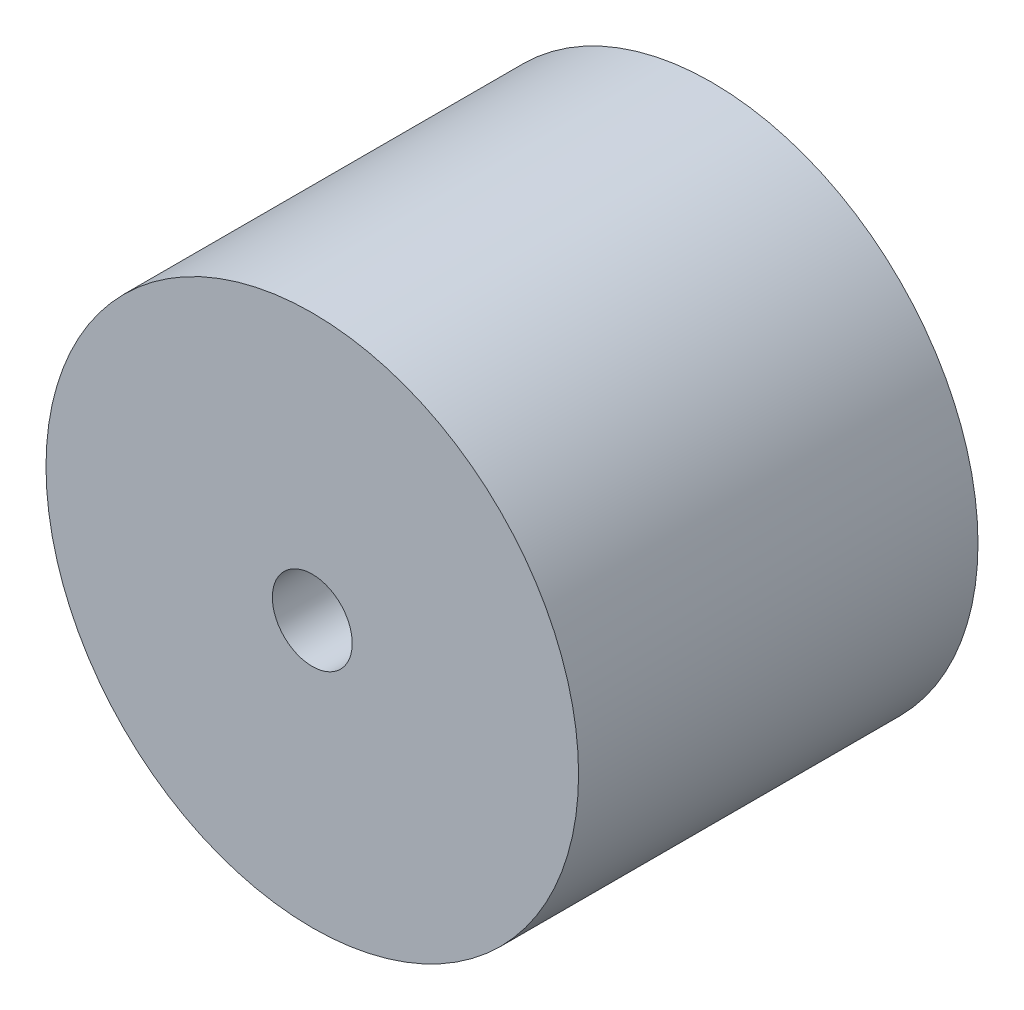
ISO-10303-21;
HEADER;
FILE_DESCRIPTION(('STEP AP214'),'2;1');
FILE_NAME('part.step','',(''),(''),'','','');
FILE_SCHEMA(('AUTOMOTIVE_DESIGN { 1 0 10303 214 1 1 1 1 }'));
ENDSEC;
DATA;
#1=APPLICATION_CONTEXT('core data for automotive mechanical design processes');
#2=APPLICATION_PROTOCOL_DEFINITION('international standard','automotive_design',2000,#1);
#3=PRODUCT_CONTEXT('',#1,'mechanical');
#4=PRODUCT('Part','Part','',(#3));
#5=PRODUCT_RELATED_PRODUCT_CATEGORY('part','',(#4));
#6=PRODUCT_DEFINITION_FORMATION('','',#4);
#7=PRODUCT_DEFINITION_CONTEXT('part definition',#1,'design');
#8=PRODUCT_DEFINITION('design','',#6,#7);
#9=PRODUCT_DEFINITION_SHAPE('','',#8);
#10=(LENGTH_UNIT() NAMED_UNIT(*) SI_UNIT(.MILLI.,.METRE.));
#11=(NAMED_UNIT(*) PLANE_ANGLE_UNIT() SI_UNIT($,.RADIAN.));
#12=(NAMED_UNIT(*) SI_UNIT($,.STERADIAN.) SOLID_ANGLE_UNIT());
#13=UNCERTAINTY_MEASURE_WITH_UNIT(LENGTH_MEASURE(1.E-05),#10,'distance_accuracy_value','');
#14=(GEOMETRIC_REPRESENTATION_CONTEXT(3) GLOBAL_UNCERTAINTY_ASSIGNED_CONTEXT((#13)) GLOBAL_UNIT_ASSIGNED_CONTEXT((#10,
#11,#12)) REPRESENTATION_CONTEXT('',''));
#15=CARTESIAN_POINT('',(0.,0.,0.));
#16=DIRECTION('',(0.,0.,1.));
#17=DIRECTION('',(1.,0.,0.));
#18=AXIS2_PLACEMENT_3D('',#15,#16,#17);
#19=CARTESIAN_POINT('',(0.,0.,0.));
#20=DIRECTION('',(0.,0.,1.));
#21=DIRECTION('',(1.,0.,0.));
#22=AXIS2_PLACEMENT_3D('',#19,#20,#21);
#23=PLANE('',#22);
#24=CARTESIAN_POINT('',(0.,12.,0.));
#25=DIRECTION('',(0.,0.,-1.));
#26=DIRECTION('',(-1.,0.,0.));
#27=AXIS2_PLACEMENT_3D('',#24,#25,#26);
#28=CIRCLE('',#27,3.5);
#29=CARTESIAN_POINT('',(-3.5,12.,0.));
#30=VERTEX_POINT('',#29);
#31=EDGE_CURVE('E70',#30,#30,#28,.T.);
#32=ORIENTED_EDGE('',*,*,#31,.F.);
#33=EDGE_LOOP('',(#32));
#34=FACE_BOUND('',#33,.T.);
#35=CARTESIAN_POINT('',(0.,0.,0.));
#36=DIRECTION('',(0.,0.,1.));
#37=DIRECTION('',(1.,0.,0.));
#38=AXIS2_PLACEMENT_3D('',#35,#36,#37);
#39=CIRCLE('',#38,20.);
#40=CARTESIAN_POINT('',(20.,0.,0.));
#41=VERTEX_POINT('',#40);
#42=EDGE_CURVE('E10',#41,#41,#39,.T.);
#43=ORIENTED_EDGE('',*,*,#42,.F.);
#44=EDGE_LOOP('',(#43));
#45=FACE_BOUND('',#44,.T.);
#46=CARTESIAN_POINT('',(0.,0.,0.));
#47=DIRECTION('',(0.,0.,1.));
#48=DIRECTION('',(1.,0.,0.));
#49=AXIS2_PLACEMENT_3D('',#46,#47,#48);
#50=CIRCLE('',#49,7.);
#51=CARTESIAN_POINT('',(7.,0.,0.));
#52=VERTEX_POINT('',#51);
#53=EDGE_CURVE('E45',#52,#52,#50,.T.);
#54=ORIENTED_EDGE('',*,*,#53,.T.);
#55=EDGE_LOOP('',(#54));
#56=FACE_BOUND('',#55,.T.);
#57=ADVANCED_FACE('F37',(#34,#45,#56),#23,.F.);
#58=CARTESIAN_POINT('',(0.,0.,20.));
#59=DIRECTION('',(0.,0.,-1.));
#60=DIRECTION('',(-1.,0.,0.));
#61=AXIS2_PLACEMENT_3D('',#58,#59,#60);
#62=CYLINDRICAL_SURFACE('',#61,20.);
#63=ORIENTED_EDGE('',*,*,#42,.T.);
#64=EDGE_LOOP('',(#63));
#65=FACE_BOUND('',#64,.T.);
#66=CARTESIAN_POINT('',(0.,0.,30.));
#67=DIRECTION('',(0.,0.,1.));
#68=DIRECTION('',(1.,0.,0.));
#69=AXIS2_PLACEMENT_3D('',#66,#67,#68);
#70=CIRCLE('',#69,20.);
#71=CARTESIAN_POINT('',(20.,0.,30.));
#72=VERTEX_POINT('',#71);
#73=EDGE_CURVE('E55',#72,#72,#70,.T.);
#74=ORIENTED_EDGE('',*,*,#73,.F.);
#75=EDGE_LOOP('',(#74));
#76=FACE_BOUND('',#75,.T.);
#77=ADVANCED_FACE('F39',(#65,#76),#62,.T.);
#78=CARTESIAN_POINT('',(0.,0.,20.));
#79=DIRECTION('',(0.,0.,-1.));
#80=DIRECTION('',(-1.,0.,0.));
#81=AXIS2_PLACEMENT_3D('',#78,#79,#80);
#82=CYLINDRICAL_SURFACE('',#81,7.);
#83=CARTESIAN_POINT('',(0.,0.,20.));
#84=DIRECTION('',(0.,0.,1.));
#85=DIRECTION('',(1.,0.,0.));
#86=AXIS2_PLACEMENT_3D('',#83,#84,#85);
#87=CIRCLE('',#86,7.);
#88=CARTESIAN_POINT('',(7.,0.,20.));
#89=VERTEX_POINT('',#88);
#90=EDGE_CURVE('E50',#89,#89,#87,.T.);
#91=ORIENTED_EDGE('',*,*,#90,.T.);
#92=EDGE_LOOP('',(#91));
#93=FACE_BOUND('',#92,.T.);
#94=ORIENTED_EDGE('',*,*,#53,.F.);
#95=EDGE_LOOP('',(#94));
#96=FACE_BOUND('',#95,.T.);
#97=ADVANCED_FACE('F92',(#93,#96),#82,.F.);
#98=CARTESIAN_POINT('',(0.,0.,20.));
#99=DIRECTION('',(0.,0.,1.));
#100=DIRECTION('',(1.,0.,0.));
#101=AXIS2_PLACEMENT_3D('',#98,#99,#100);
#102=PLANE('',#101);
#103=CARTESIAN_POINT('',(0.,0.,20.));
#104=DIRECTION('',(0.,0.,1.));
#105=DIRECTION('',(1.,0.,0.));
#106=AXIS2_PLACEMENT_3D('',#103,#104,#105);
#107=CIRCLE('',#106,3.);
#108=CARTESIAN_POINT('',(3.,0.,20.));
#109=VERTEX_POINT('',#108);
#110=EDGE_CURVE('E61',#109,#109,#107,.T.);
#111=ORIENTED_EDGE('',*,*,#110,.T.);
#112=EDGE_LOOP('',(#111));
#113=FACE_BOUND('',#112,.T.);
#114=ORIENTED_EDGE('',*,*,#90,.F.);
#115=EDGE_LOOP('',(#114));
#116=FACE_BOUND('',#115,.T.);
#117=ADVANCED_FACE('F96',(#113,#116),#102,.F.);
#118=CARTESIAN_POINT('',(0.,0.,30.));
#119=DIRECTION('',(0.,0.,1.));
#120=DIRECTION('',(1.,0.,0.));
#121=AXIS2_PLACEMENT_3D('',#118,#119,#120);
#122=PLANE('',#121);
#123=CARTESIAN_POINT('',(0.,0.,30.));
#124=DIRECTION('',(0.,0.,1.));
#125=DIRECTION('',(1.,0.,0.));
#126=AXIS2_PLACEMENT_3D('',#123,#124,#125);
#127=CIRCLE('',#126,3.);
#128=CARTESIAN_POINT('',(3.,0.,30.));
#129=VERTEX_POINT('',#128);
#130=EDGE_CURVE('E62',#129,#129,#127,.T.);
#131=ORIENTED_EDGE('',*,*,#130,.F.);
#132=EDGE_LOOP('',(#131));
#133=FACE_BOUND('',#132,.T.);
#134=ORIENTED_EDGE('',*,*,#73,.T.);
#135=EDGE_LOOP('',(#134));
#136=FACE_BOUND('',#135,.T.);
#137=ADVANCED_FACE('F100',(#133,#136),#122,.T.);
#138=CARTESIAN_POINT('',(0.,0.,20.));
#139=DIRECTION('',(0.,0.,1.));
#140=DIRECTION('',(1.,0.,0.));
#141=AXIS2_PLACEMENT_3D('',#138,#139,#140);
#142=CYLINDRICAL_SURFACE('',#141,3.);
#143=ORIENTED_EDGE('',*,*,#110,.F.);
#144=EDGE_LOOP('',(#143));
#145=FACE_BOUND('',#144,.T.);
#146=ORIENTED_EDGE('',*,*,#130,.T.);
#147=EDGE_LOOP('',(#146));
#148=FACE_BOUND('',#147,.T.);
#149=ADVANCED_FACE('F83',(#145,#148),#142,.F.);
#150=CARTESIAN_POINT('',(0.,12.,25.));
#151=DIRECTION('',(0.,0.,-1.));
#152=DIRECTION('',(-1.,0.,0.));
#153=AXIS2_PLACEMENT_3D('',#150,#151,#152);
#154=CYLINDRICAL_SURFACE('',#153,3.5);
#155=CARTESIAN_POINT('',(0.,12.,25.));
#156=DIRECTION('',(0.,0.,-1.));
#157=DIRECTION('',(-1.,0.,0.));
#158=AXIS2_PLACEMENT_3D('',#155,#156,#157);
#159=CIRCLE('',#158,3.5);
#160=CARTESIAN_POINT('',(-3.5,12.,25.));
#161=VERTEX_POINT('',#160);
#162=EDGE_CURVE('E66',#161,#161,#159,.T.);
#163=ORIENTED_EDGE('',*,*,#162,.F.);
#164=EDGE_LOOP('',(#163));
#165=FACE_BOUND('',#164,.T.);
#166=ORIENTED_EDGE('',*,*,#31,.T.);
#167=EDGE_LOOP('',(#166));
#168=FACE_BOUND('',#167,.T.);
#169=ADVANCED_FACE('F80',(#165,#168),#154,.F.);
#170=CARTESIAN_POINT('',(0.,12.,25.));
#171=DIRECTION('',(0.,0.,-1.));
#172=DIRECTION('',(-1.,0.,0.));
#173=AXIS2_PLACEMENT_3D('',#170,#171,#172);
#174=PLANE('',#173);
#175=ORIENTED_EDGE('',*,*,#162,.T.);
#176=EDGE_LOOP('',(#175));
#177=FACE_BOUND('',#176,.T.);
#178=ADVANCED_FACE('F78',(#177),#174,.T.);
#179=CLOSED_SHELL('',(#57,#77,#97,#117,#137,#149,#169,#178));
#180=MANIFOLD_SOLID_BREP('B2',#179);
#181=ADVANCED_BREP_SHAPE_REPRESENTATION('',(#18,#180),#14);
#182=SHAPE_DEFINITION_REPRESENTATION(#9,#181);
ENDSEC;
END-ISO-10303-21;
